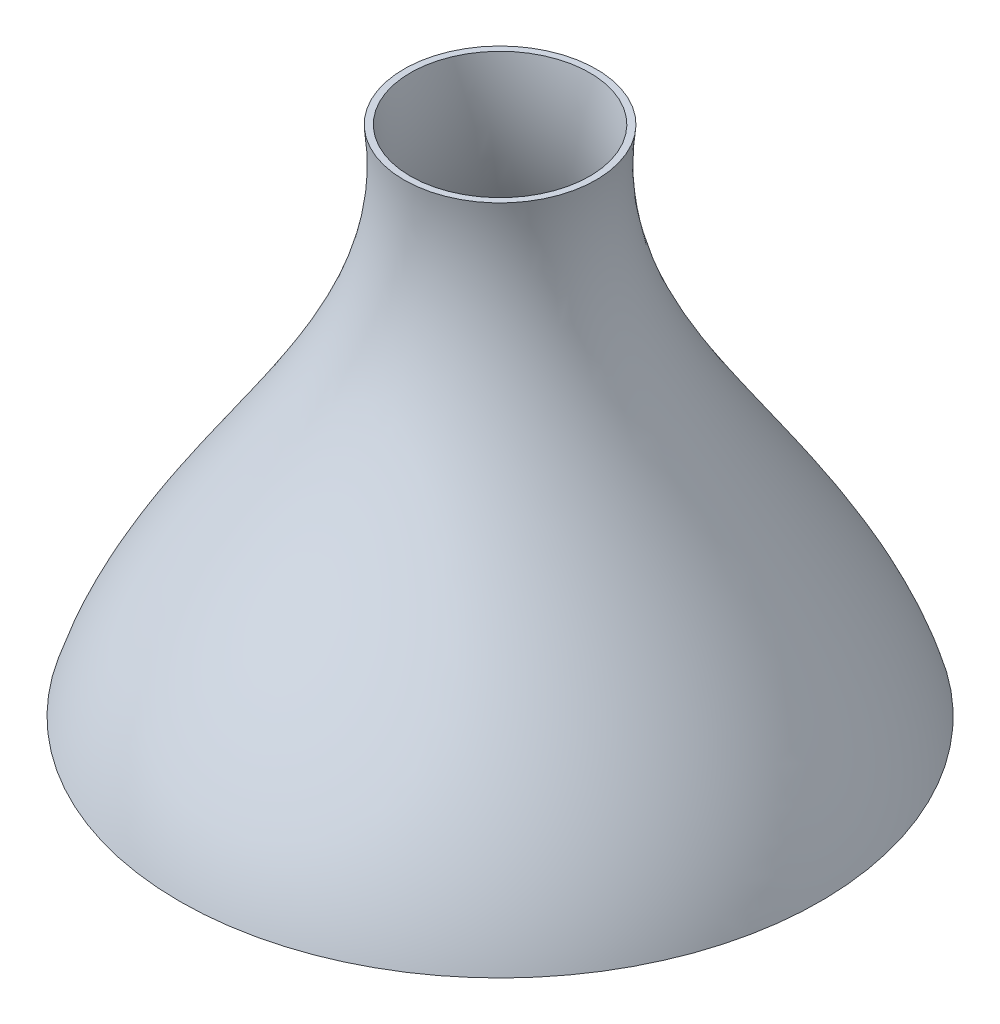
ISO-10303-21;
HEADER;
FILE_DESCRIPTION(('STEP AP214'),'2;1');
FILE_NAME('part.step','',(''),(''),'','','');
FILE_SCHEMA(('AUTOMOTIVE_DESIGN { 1 0 10303 214 1 1 1 1 }'));
ENDSEC;
DATA;
#1=APPLICATION_CONTEXT('core data for automotive mechanical design processes');
#2=APPLICATION_PROTOCOL_DEFINITION('international standard','automotive_design',2000,#1);
#3=PRODUCT_CONTEXT('',#1,'mechanical');
#4=PRODUCT('Part','Part','',(#3));
#5=PRODUCT_RELATED_PRODUCT_CATEGORY('part','',(#4));
#6=PRODUCT_DEFINITION_FORMATION('','',#4);
#7=PRODUCT_DEFINITION_CONTEXT('part definition',#1,'design');
#8=PRODUCT_DEFINITION('design','',#6,#7);
#9=PRODUCT_DEFINITION_SHAPE('','',#8);
#10=(LENGTH_UNIT() NAMED_UNIT(*) SI_UNIT(.MILLI.,.METRE.));
#11=(NAMED_UNIT(*) PLANE_ANGLE_UNIT() SI_UNIT($,.RADIAN.));
#12=(NAMED_UNIT(*) SI_UNIT($,.STERADIAN.) SOLID_ANGLE_UNIT());
#13=UNCERTAINTY_MEASURE_WITH_UNIT(LENGTH_MEASURE(1.E-05),#10,'distance_accuracy_value','');
#14=(GEOMETRIC_REPRESENTATION_CONTEXT(3) GLOBAL_UNCERTAINTY_ASSIGNED_CONTEXT((#13)) GLOBAL_UNIT_ASSIGNED_CONTEXT((#10,
#11,#12)) REPRESENTATION_CONTEXT('',''));
#15=CARTESIAN_POINT('',(0.,0.,0.));
#16=DIRECTION('',(0.,0.,1.));
#17=DIRECTION('',(1.,0.,0.));
#18=AXIS2_PLACEMENT_3D('',#15,#16,#17);
#19=CARTESIAN_POINT('',(0.,46.1845386533666,0.));
#20=DIRECTION('',(0.,1.,0.));
#21=DIRECTION('',(0.,0.,1.));
#22=AXIS2_PLACEMENT_3D('',#19,#20,#21);
#23=PLANE('',#22);
#24=CARTESIAN_POINT('',(0.,46.1845386533666,0.));
#25=DIRECTION('',(0.,1.,0.));
#26=DIRECTION('',(0.,0.,1.));
#27=AXIS2_PLACEMENT_3D('',#24,#25,#26);
#28=CIRCLE('',#27,13.9922644532362);
#29=CARTESIAN_POINT('',(0.,46.1845386533666,13.9922644532362));
#30=VERTEX_POINT('',#29);
#31=EDGE_CURVE('E43',#30,#30,#28,.T.);
#32=ORIENTED_EDGE('',*,*,#31,.F.);
#33=EDGE_LOOP('',(#32));
#34=FACE_BOUND('',#33,.T.);
#35=CARTESIAN_POINT('',(0.,46.1845386533666,0.));
#36=DIRECTION('',(0.,1.,0.));
#37=DIRECTION('',(0.,0.,1.));
#38=AXIS2_PLACEMENT_3D('',#35,#36,#37);
#39=CIRCLE('',#38,15.);
#40=CARTESIAN_POINT('',(0.,46.1845386533666,15.));
#41=VERTEX_POINT('',#40);
#42=EDGE_CURVE('E10',#41,#41,#39,.T.);
#43=ORIENTED_EDGE('',*,*,#42,.T.);
#44=EDGE_LOOP('',(#43));
#45=FACE_BOUND('',#44,.T.);
#46=ADVANCED_FACE('F33',(#34,#45),#23,.T.);
#47=CARTESIAN_POINT('',(15.,46.1845386533666,0.));
#48=CARTESIAN_POINT('',(11.0526996237099,14.8643524770422,0.));
#49=CARTESIAN_POINT('',(42.0052990408781,-6.73434328635641,0.));
#50=CARTESIAN_POINT('',(50.,-33.8154613466334,0.));
#51=B_SPLINE_CURVE_WITH_KNOTS('',3,(#47,#48,#49,#50),.UNSPECIFIED.,.F.,.F.,(4,4),(0.,1.),.UNSPECIFIED.);
#52=CARTESIAN_POINT('',(0.,46.1845386533666,0.));
#53=DIRECTION('',(0.,1.,0.));
#54=AXIS1_PLACEMENT('',#52,#53);
#55=SURFACE_OF_REVOLUTION('',#51,#54);
#56=CARTESIAN_POINT('',(0.,-33.8154613466334,0.));
#57=DIRECTION('',(0.,1.,0.));
#58=DIRECTION('',(0.,0.,1.));
#59=AXIS2_PLACEMENT_3D('',#56,#57,#58);
#60=CIRCLE('',#59,50.);
#61=CARTESIAN_POINT('',(0.,-33.8154613466334,50.));
#62=VERTEX_POINT('',#61);
#63=EDGE_CURVE('E39',#62,#62,#60,.T.);
#64=ORIENTED_EDGE('',*,*,#63,.T.);
#65=EDGE_LOOP('',(#64));
#66=FACE_BOUND('',#65,.T.);
#67=ORIENTED_EDGE('',*,*,#42,.F.);
#68=EDGE_LOOP('',(#67));
#69=FACE_BOUND('',#68,.T.);
#70=ADVANCED_FACE('F58',(#66,#69),#55,.F.);
#71=CARTESIAN_POINT('',(0.,-33.8154613466334,0.));
#72=DIRECTION('',(0.,1.,0.));
#73=DIRECTION('',(0.,0.,1.));
#74=AXIS2_PLACEMENT_3D('',#71,#72,#73);
#75=PLANE('',#74);
#76=CARTESIAN_POINT('',(0.,-33.8154613466334,0.));
#77=DIRECTION('',(0.,-1.,0.));
#78=DIRECTION('',(0.,0.,-1.));
#79=AXIS2_PLACEMENT_3D('',#76,#77,#78);
#80=CIRCLE('',#79,49.5);
#81=CARTESIAN_POINT('',(0.,-33.8154613466334,-49.5));
#82=VERTEX_POINT('',#81);
#83=EDGE_CURVE('E118',#82,#82,#80,.T.);
#84=ORIENTED_EDGE('',*,*,#83,.F.);
#85=EDGE_LOOP('',(#84));
#86=FACE_BOUND('',#85,.T.);
#87=ORIENTED_EDGE('',*,*,#63,.F.);
#88=EDGE_LOOP('',(#87));
#89=FACE_BOUND('',#88,.T.);
#90=ADVANCED_FACE('F62',(#86,#89),#75,.F.);
#91=CARTESIAN_POINT('',(15.,46.1845386533666,0.));
#92=CARTESIAN_POINT('',(11.0526996237099,14.8643524770422,0.));
#93=CARTESIAN_POINT('',(42.0052990408781,-6.73434328635641,0.));
#94=CARTESIAN_POINT('',(50.,-33.8154613466334,0.));
#95=B_SPLINE_CURVE_WITH_KNOTS('',3,(#91,#92,#93,#94),.UNSPECIFIED.,.F.,.F.,(4,4),(0.,1.),.UNSPECIFIED.);
#96=CARTESIAN_POINT('',(0.,46.1845386533666,0.));
#97=DIRECTION('',(0.,1.,0.));
#98=AXIS1_PLACEMENT('',#96,#97);
#99=SURFACE_OF_REVOLUTION('',#95,#98);
#100=OFFSET_SURFACE('',#99,1.,.F.);
#101=CARTESIAN_POINT('',(0.,-32.8154613466334,0.));
#102=DIRECTION('',(0.,1.,0.));
#103=DIRECTION('',(0.,0.,1.));
#104=AXIS2_PLACEMENT_3D('',#101,#102,#103);
#105=CIRCLE('',#104,48.6435030320477);
#106=CARTESIAN_POINT('',(0.,-32.8154613466334,48.6435030320477));
#107=VERTEX_POINT('',#106);
#108=EDGE_CURVE('E47',#107,#107,#105,.T.);
#109=ORIENTED_EDGE('',*,*,#108,.F.);
#110=EDGE_LOOP('',(#109));
#111=FACE_BOUND('',#110,.T.);
#112=ORIENTED_EDGE('',*,*,#31,.T.);
#113=EDGE_LOOP('',(#112));
#114=FACE_BOUND('',#113,.T.);
#115=ADVANCED_FACE('F63',(#111,#114),#100,.T.);
#116=CARTESIAN_POINT('',(0.,-32.8154613466334,0.));
#117=DIRECTION('',(0.,-1.,0.));
#118=DIRECTION('',(0.,0.,-1.));
#119=AXIS2_PLACEMENT_3D('',#116,#117,#118);
#120=PLANE('',#119);
#121=CARTESIAN_POINT('',(0.,-32.8154613466334,0.));
#122=DIRECTION('',(0.,-1.,0.));
#123=DIRECTION('',(0.,0.,-1.));
#124=AXIS2_PLACEMENT_3D('',#121,#122,#123);
#125=CIRCLE('',#124,49.5);
#126=CARTESIAN_POINT('',(0.,-32.8154613466334,-49.5));
#127=VERTEX_POINT('',#126);
#128=EDGE_CURVE('E116',#127,#127,#125,.T.);
#129=ORIENTED_EDGE('',*,*,#128,.T.);
#130=EDGE_LOOP('',(#129));
#131=FACE_BOUND('',#130,.T.);
#132=ORIENTED_EDGE('',*,*,#108,.T.);
#133=EDGE_LOOP('',(#132));
#134=FACE_BOUND('',#133,.T.);
#135=ADVANCED_FACE('F71',(#131,#134),#120,.T.);
#136=CARTESIAN_POINT('',(0.,-32.8154613466334,0.));
#137=DIRECTION('',(0.,-1.,0.));
#138=DIRECTION('',(0.,0.,-1.));
#139=AXIS2_PLACEMENT_3D('',#136,#137,#138);
#140=CYLINDRICAL_SURFACE('',#139,49.5);
#141=ORIENTED_EDGE('',*,*,#128,.F.);
#142=EDGE_LOOP('',(#141));
#143=FACE_BOUND('',#142,.T.);
#144=ORIENTED_EDGE('',*,*,#83,.T.);
#145=EDGE_LOOP('',(#144));
#146=FACE_BOUND('',#145,.T.);
#147=ADVANCED_FACE('F101',(#143,#146),#140,.F.);
#148=CLOSED_SHELL('',(#46,#70,#90,#115,#135,#147));
#149=MANIFOLD_SOLID_BREP('B2',#148);
#150=ADVANCED_BREP_SHAPE_REPRESENTATION('',(#18,#149),#14);
#151=SHAPE_DEFINITION_REPRESENTATION(#9,#150);
ENDSEC;
END-ISO-10303-21;
